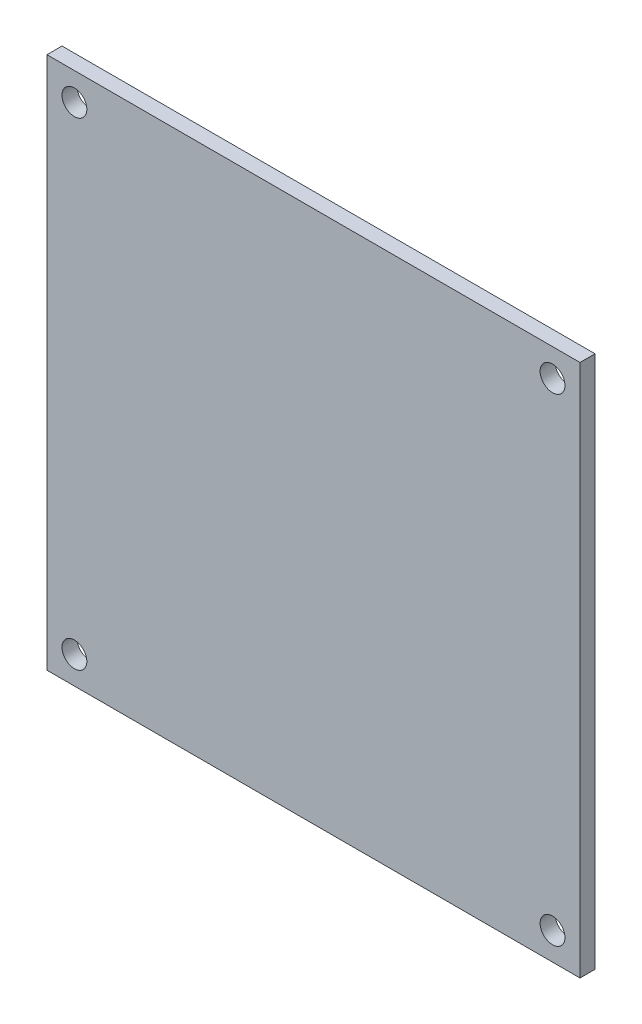
ISO-10303-21;
HEADER;
FILE_DESCRIPTION(('STEP AP214'),'2;1');
FILE_NAME('part.step','',(''),(''),'','','');
FILE_SCHEMA(('AUTOMOTIVE_DESIGN { 1 0 10303 214 1 1 1 1 }'));
ENDSEC;
DATA;
#1=APPLICATION_CONTEXT('core data for automotive mechanical design processes');
#2=APPLICATION_PROTOCOL_DEFINITION('international standard','automotive_design',2000,#1);
#3=PRODUCT_CONTEXT('',#1,'mechanical');
#4=PRODUCT('Part','Part','',(#3));
#5=PRODUCT_RELATED_PRODUCT_CATEGORY('part','',(#4));
#6=PRODUCT_DEFINITION_FORMATION('','',#4);
#7=PRODUCT_DEFINITION_CONTEXT('part definition',#1,'design');
#8=PRODUCT_DEFINITION('design','',#6,#7);
#9=PRODUCT_DEFINITION_SHAPE('','',#8);
#10=(LENGTH_UNIT() NAMED_UNIT(*) SI_UNIT(.MILLI.,.METRE.));
#11=(NAMED_UNIT(*) PLANE_ANGLE_UNIT() SI_UNIT($,.RADIAN.));
#12=(NAMED_UNIT(*) SI_UNIT($,.STERADIAN.) SOLID_ANGLE_UNIT());
#13=UNCERTAINTY_MEASURE_WITH_UNIT(LENGTH_MEASURE(1.E-05),#10,'distance_accuracy_value','');
#14=(GEOMETRIC_REPRESENTATION_CONTEXT(3) GLOBAL_UNCERTAINTY_ASSIGNED_CONTEXT((#13)) GLOBAL_UNIT_ASSIGNED_CONTEXT((#10,
#11,#12)) REPRESENTATION_CONTEXT('',''));
#15=CARTESIAN_POINT('',(0.,0.,0.));
#16=DIRECTION('',(0.,0.,1.));
#17=DIRECTION('',(1.,0.,0.));
#18=AXIS2_PLACEMENT_3D('',#15,#16,#17);
#19=CARTESIAN_POINT('',(0.,0.,5.));
#20=DIRECTION('',(0.,1.,0.));
#21=DIRECTION('',(0.,0.,1.));
#22=AXIS2_PLACEMENT_3D('',#19,#20,#21);
#23=PLANE('',#22);
#24=DIRECTION('',(1.,0.,0.));
#25=VECTOR('',#24,1.);
#26=CARTESIAN_POINT('',(0.,0.,0.));
#27=LINE('',#26,#25);
#28=CARTESIAN_POINT('',(0.,0.,0.));
#29=VERTEX_POINT('',#28);
#30=CARTESIAN_POINT('',(177.,0.,0.));
#31=VERTEX_POINT('',#30);
#32=EDGE_CURVE('E111',#29,#31,#27,.T.);
#33=ORIENTED_EDGE('',*,*,#32,.T.);
#34=DIRECTION('',(0.,0.,-1.));
#35=VECTOR('',#34,1.);
#36=CARTESIAN_POINT('',(177.,0.,5.));
#37=LINE('',#36,#35);
#38=CARTESIAN_POINT('',(177.,0.,5.));
#39=VERTEX_POINT('',#38);
#40=EDGE_CURVE('E11',#39,#31,#37,.T.);
#41=ORIENTED_EDGE('',*,*,#40,.F.);
#42=DIRECTION('',(1.,0.,0.));
#43=VECTOR('',#42,1.);
#44=CARTESIAN_POINT('',(0.,0.,5.));
#45=LINE('',#44,#43);
#46=CARTESIAN_POINT('',(0.,0.,5.));
#47=VERTEX_POINT('',#46);
#48=EDGE_CURVE('E85',#47,#39,#45,.T.);
#49=ORIENTED_EDGE('',*,*,#48,.F.);
#50=DIRECTION('',(0.,0.,-1.));
#51=VECTOR('',#50,1.);
#52=CARTESIAN_POINT('',(0.,0.,5.));
#53=LINE('',#52,#51);
#54=EDGE_CURVE('E51',#47,#29,#53,.T.);
#55=ORIENTED_EDGE('',*,*,#54,.T.);
#56=EDGE_LOOP('',(#33,#41,#49,#55));
#57=FACE_BOUND('',#56,.T.);
#58=ADVANCED_FACE('F35',(#57),#23,.F.);
#59=CARTESIAN_POINT('',(177.,0.,5.));
#60=DIRECTION('',(-1.,0.,0.));
#61=DIRECTION('',(0.,-1.,0.));
#62=AXIS2_PLACEMENT_3D('',#59,#60,#61);
#63=PLANE('',#62);
#64=DIRECTION('',(0.,1.,0.));
#65=VECTOR('',#64,1.);
#66=CARTESIAN_POINT('',(177.,0.,0.));
#67=LINE('',#66,#65);
#68=CARTESIAN_POINT('',(177.,177.,0.));
#69=VERTEX_POINT('',#68);
#70=EDGE_CURVE('E90',#31,#69,#67,.T.);
#71=ORIENTED_EDGE('',*,*,#70,.T.);
#72=DIRECTION('',(0.,0.,-1.));
#73=VECTOR('',#72,1.);
#74=CARTESIAN_POINT('',(177.,177.,5.));
#75=LINE('',#74,#73);
#76=CARTESIAN_POINT('',(177.,177.,5.));
#77=VERTEX_POINT('',#76);
#78=EDGE_CURVE('E43',#77,#69,#75,.T.);
#79=ORIENTED_EDGE('',*,*,#78,.F.);
#80=DIRECTION('',(0.,1.,0.));
#81=VECTOR('',#80,1.);
#82=CARTESIAN_POINT('',(177.,0.,5.));
#83=LINE('',#82,#81);
#84=EDGE_CURVE('E76',#39,#77,#83,.T.);
#85=ORIENTED_EDGE('',*,*,#84,.F.);
#86=ORIENTED_EDGE('',*,*,#40,.T.);
#87=EDGE_LOOP('',(#71,#79,#85,#86));
#88=FACE_BOUND('',#87,.T.);
#89=ADVANCED_FACE('F89',(#88),#63,.F.);
#90=CARTESIAN_POINT('',(0.,177.,5.));
#91=DIRECTION('',(0.,1.,0.));
#92=DIRECTION('',(0.,0.,1.));
#93=AXIS2_PLACEMENT_3D('',#90,#91,#92);
#94=PLANE('',#93);
#95=DIRECTION('',(1.,0.,0.));
#96=VECTOR('',#95,1.);
#97=CARTESIAN_POINT('',(0.,177.,0.));
#98=LINE('',#97,#96);
#99=CARTESIAN_POINT('',(0.,177.,0.));
#100=VERTEX_POINT('',#99);
#101=EDGE_CURVE('E114',#100,#69,#98,.T.);
#102=ORIENTED_EDGE('',*,*,#101,.F.);
#103=DIRECTION('',(0.,0.,-1.));
#104=VECTOR('',#103,1.);
#105=CARTESIAN_POINT('',(0.,177.,5.));
#106=LINE('',#105,#104);
#107=CARTESIAN_POINT('',(0.,177.,5.));
#108=VERTEX_POINT('',#107);
#109=EDGE_CURVE('E65',#108,#100,#106,.T.);
#110=ORIENTED_EDGE('',*,*,#109,.F.);
#111=DIRECTION('',(1.,0.,0.));
#112=VECTOR('',#111,1.);
#113=CARTESIAN_POINT('',(0.,177.,5.));
#114=LINE('',#113,#112);
#115=EDGE_CURVE('E84',#108,#77,#114,.T.);
#116=ORIENTED_EDGE('',*,*,#115,.T.);
#117=ORIENTED_EDGE('',*,*,#78,.T.);
#118=EDGE_LOOP('',(#102,#110,#116,#117));
#119=FACE_BOUND('',#118,.T.);
#120=ADVANCED_FACE('F93',(#119),#94,.T.);
#121=CARTESIAN_POINT('',(9.125,9.12500000000001,5.));
#122=DIRECTION('',(0.,0.,-1.));
#123=DIRECTION('',(-1.,0.,0.));
#124=AXIS2_PLACEMENT_3D('',#121,#122,#123);
#125=CYLINDRICAL_SURFACE('',#124,4.125);
#126=CARTESIAN_POINT('',(9.125,9.12500000000001,5.));
#127=DIRECTION('',(0.,0.,1.));
#128=DIRECTION('',(1.,0.,0.));
#129=AXIS2_PLACEMENT_3D('',#126,#127,#128);
#130=CIRCLE('',#129,4.125);
#131=CARTESIAN_POINT('',(13.25,9.12500000000001,5.));
#132=VERTEX_POINT('',#131);
#133=EDGE_CURVE('E105',#132,#132,#130,.T.);
#134=ORIENTED_EDGE('',*,*,#133,.T.);
#135=EDGE_LOOP('',(#134));
#136=FACE_BOUND('',#135,.T.);
#137=CARTESIAN_POINT('',(9.125,9.12500000000001,0.));
#138=DIRECTION('',(0.,0.,1.));
#139=DIRECTION('',(1.,0.,0.));
#140=AXIS2_PLACEMENT_3D('',#137,#138,#139);
#141=CIRCLE('',#140,4.125);
#142=CARTESIAN_POINT('',(13.25,9.12500000000001,0.));
#143=VERTEX_POINT('',#142);
#144=EDGE_CURVE('E125',#143,#143,#141,.T.);
#145=ORIENTED_EDGE('',*,*,#144,.F.);
#146=EDGE_LOOP('',(#145));
#147=FACE_BOUND('',#146,.T.);
#148=ADVANCED_FACE('F165',(#136,#147),#125,.F.);
#149=CARTESIAN_POINT('',(167.875,167.875,5.));
#150=DIRECTION('',(0.,0.,-1.));
#151=DIRECTION('',(-1.,0.,0.));
#152=AXIS2_PLACEMENT_3D('',#149,#150,#151);
#153=CYLINDRICAL_SURFACE('',#152,4.125);
#154=CARTESIAN_POINT('',(167.875,167.875,5.));
#155=DIRECTION('',(0.,0.,1.));
#156=DIRECTION('',(1.,0.,0.));
#157=AXIS2_PLACEMENT_3D('',#154,#155,#156);
#158=CIRCLE('',#157,4.125);
#159=CARTESIAN_POINT('',(172.,167.875,5.));
#160=VERTEX_POINT('',#159);
#161=EDGE_CURVE('E102',#160,#160,#158,.T.);
#162=ORIENTED_EDGE('',*,*,#161,.T.);
#163=EDGE_LOOP('',(#162));
#164=FACE_BOUND('',#163,.T.);
#165=CARTESIAN_POINT('',(167.875,167.875,0.));
#166=DIRECTION('',(0.,0.,1.));
#167=DIRECTION('',(1.,0.,0.));
#168=AXIS2_PLACEMENT_3D('',#165,#166,#167);
#169=CIRCLE('',#168,4.125);
#170=CARTESIAN_POINT('',(172.,167.875,0.));
#171=VERTEX_POINT('',#170);
#172=EDGE_CURVE('E122',#171,#171,#169,.T.);
#173=ORIENTED_EDGE('',*,*,#172,.F.);
#174=EDGE_LOOP('',(#173));
#175=FACE_BOUND('',#174,.T.);
#176=ADVANCED_FACE('F159',(#164,#175),#153,.F.);
#177=CARTESIAN_POINT('',(9.12499999999999,167.875,5.));
#178=DIRECTION('',(0.,0.,-1.));
#179=DIRECTION('',(-1.,0.,0.));
#180=AXIS2_PLACEMENT_3D('',#177,#178,#179);
#181=CYLINDRICAL_SURFACE('',#180,4.125);
#182=CARTESIAN_POINT('',(9.12499999999999,167.875,5.));
#183=DIRECTION('',(0.,0.,1.));
#184=DIRECTION('',(1.,0.,0.));
#185=AXIS2_PLACEMENT_3D('',#182,#183,#184);
#186=CIRCLE('',#185,4.125);
#187=CARTESIAN_POINT('',(13.25,167.875,5.));
#188=VERTEX_POINT('',#187);
#189=EDGE_CURVE('E96',#188,#188,#186,.F.);
#190=ORIENTED_EDGE('',*,*,#189,.F.);
#191=EDGE_LOOP('',(#190));
#192=FACE_BOUND('',#191,.T.);
#193=CARTESIAN_POINT('',(9.12499999999999,167.875,0.));
#194=DIRECTION('',(0.,0.,1.));
#195=DIRECTION('',(1.,0.,0.));
#196=AXIS2_PLACEMENT_3D('',#193,#194,#195);
#197=CIRCLE('',#196,4.125);
#198=CARTESIAN_POINT('',(13.25,167.875,0.));
#199=VERTEX_POINT('',#198);
#200=EDGE_CURVE('E119',#199,#199,#197,.F.);
#201=ORIENTED_EDGE('',*,*,#200,.T.);
#202=EDGE_LOOP('',(#201));
#203=FACE_BOUND('',#202,.T.);
#204=ADVANCED_FACE('F152',(#192,#203),#181,.F.);
#205=CARTESIAN_POINT('',(0.,0.,5.));
#206=DIRECTION('',(-1.,0.,0.));
#207=DIRECTION('',(0.,-1.,0.));
#208=AXIS2_PLACEMENT_3D('',#205,#206,#207);
#209=PLANE('',#208);
#210=DIRECTION('',(0.,1.,0.));
#211=VECTOR('',#210,1.);
#212=CARTESIAN_POINT('',(0.,0.,0.));
#213=LINE('',#212,#211);
#214=EDGE_CURVE('E116',#29,#100,#213,.T.);
#215=ORIENTED_EDGE('',*,*,#214,.F.);
#216=ORIENTED_EDGE('',*,*,#54,.F.);
#217=DIRECTION('',(0.,1.,0.));
#218=VECTOR('',#217,1.);
#219=CARTESIAN_POINT('',(0.,0.,5.));
#220=LINE('',#219,#218);
#221=EDGE_CURVE('E94',#47,#108,#220,.T.);
#222=ORIENTED_EDGE('',*,*,#221,.T.);
#223=ORIENTED_EDGE('',*,*,#109,.T.);
#224=EDGE_LOOP('',(#215,#216,#222,#223));
#225=FACE_BOUND('',#224,.T.);
#226=ADVANCED_FACE('F150',(#225),#209,.T.);
#227=CARTESIAN_POINT('',(167.875,9.12500000000001,5.));
#228=DIRECTION('',(0.,0.,-1.));
#229=DIRECTION('',(-1.,0.,0.));
#230=AXIS2_PLACEMENT_3D('',#227,#228,#229);
#231=CYLINDRICAL_SURFACE('',#230,4.125);
#232=CARTESIAN_POINT('',(167.875,9.12500000000001,5.));
#233=DIRECTION('',(0.,0.,1.));
#234=DIRECTION('',(1.,0.,0.));
#235=AXIS2_PLACEMENT_3D('',#232,#233,#234);
#236=CIRCLE('',#235,4.125);
#237=CARTESIAN_POINT('',(172.,9.12500000000001,5.));
#238=VERTEX_POINT('',#237);
#239=EDGE_CURVE('E108',#238,#238,#236,.F.);
#240=ORIENTED_EDGE('',*,*,#239,.F.);
#241=EDGE_LOOP('',(#240));
#242=FACE_BOUND('',#241,.T.);
#243=CARTESIAN_POINT('',(167.875,9.12500000000001,0.));
#244=DIRECTION('',(0.,0.,1.));
#245=DIRECTION('',(1.,0.,0.));
#246=AXIS2_PLACEMENT_3D('',#243,#244,#245);
#247=CIRCLE('',#246,4.125);
#248=CARTESIAN_POINT('',(172.,9.12500000000001,0.));
#249=VERTEX_POINT('',#248);
#250=EDGE_CURVE('E128',#249,#249,#247,.F.);
#251=ORIENTED_EDGE('',*,*,#250,.T.);
#252=EDGE_LOOP('',(#251));
#253=FACE_BOUND('',#252,.T.);
#254=ADVANCED_FACE('F134',(#242,#253),#231,.F.);
#255=CARTESIAN_POINT('',(0.,0.,5.));
#256=DIRECTION('',(0.,0.,1.));
#257=DIRECTION('',(1.,0.,0.));
#258=AXIS2_PLACEMENT_3D('',#255,#256,#257);
#259=PLANE('',#258);
#260=ORIENTED_EDGE('',*,*,#48,.T.);
#261=ORIENTED_EDGE('',*,*,#84,.T.);
#262=ORIENTED_EDGE('',*,*,#115,.F.);
#263=ORIENTED_EDGE('',*,*,#221,.F.);
#264=EDGE_LOOP('',(#260,#261,#262,#263));
#265=FACE_BOUND('',#264,.T.);
#266=ORIENTED_EDGE('',*,*,#189,.T.);
#267=EDGE_LOOP('',(#266));
#268=FACE_BOUND('',#267,.T.);
#269=ORIENTED_EDGE('',*,*,#161,.F.);
#270=EDGE_LOOP('',(#269));
#271=FACE_BOUND('',#270,.T.);
#272=ORIENTED_EDGE('',*,*,#133,.F.);
#273=EDGE_LOOP('',(#272));
#274=FACE_BOUND('',#273,.T.);
#275=ORIENTED_EDGE('',*,*,#239,.T.);
#276=EDGE_LOOP('',(#275));
#277=FACE_BOUND('',#276,.T.);
#278=ADVANCED_FACE('F80',(#265,#268,#271,#274,#277),#259,.T.);
#279=CARTESIAN_POINT('',(0.,0.,0.));
#280=DIRECTION('',(0.,0.,1.));
#281=DIRECTION('',(1.,0.,0.));
#282=AXIS2_PLACEMENT_3D('',#279,#280,#281);
#283=PLANE('',#282);
#284=ORIENTED_EDGE('',*,*,#32,.F.);
#285=ORIENTED_EDGE('',*,*,#214,.T.);
#286=ORIENTED_EDGE('',*,*,#101,.T.);
#287=ORIENTED_EDGE('',*,*,#70,.F.);
#288=EDGE_LOOP('',(#284,#285,#286,#287));
#289=FACE_BOUND('',#288,.T.);
#290=ORIENTED_EDGE('',*,*,#200,.F.);
#291=EDGE_LOOP('',(#290));
#292=FACE_BOUND('',#291,.T.);
#293=ORIENTED_EDGE('',*,*,#172,.T.);
#294=EDGE_LOOP('',(#293));
#295=FACE_BOUND('',#294,.T.);
#296=ORIENTED_EDGE('',*,*,#144,.T.);
#297=EDGE_LOOP('',(#296));
#298=FACE_BOUND('',#297,.T.);
#299=ORIENTED_EDGE('',*,*,#250,.F.);
#300=EDGE_LOOP('',(#299));
#301=FACE_BOUND('',#300,.T.);
#302=ADVANCED_FACE('F136',(#289,#292,#295,#298,#301),#283,.F.);
#303=CLOSED_SHELL('',(#58,#89,#120,#148,#176,#204,#226,#254,#278,#302));
#304=MANIFOLD_SOLID_BREP('B2',#303);
#305=ADVANCED_BREP_SHAPE_REPRESENTATION('',(#18,#304),#14);
#306=SHAPE_DEFINITION_REPRESENTATION(#9,#305);
ENDSEC;
END-ISO-10303-21;
